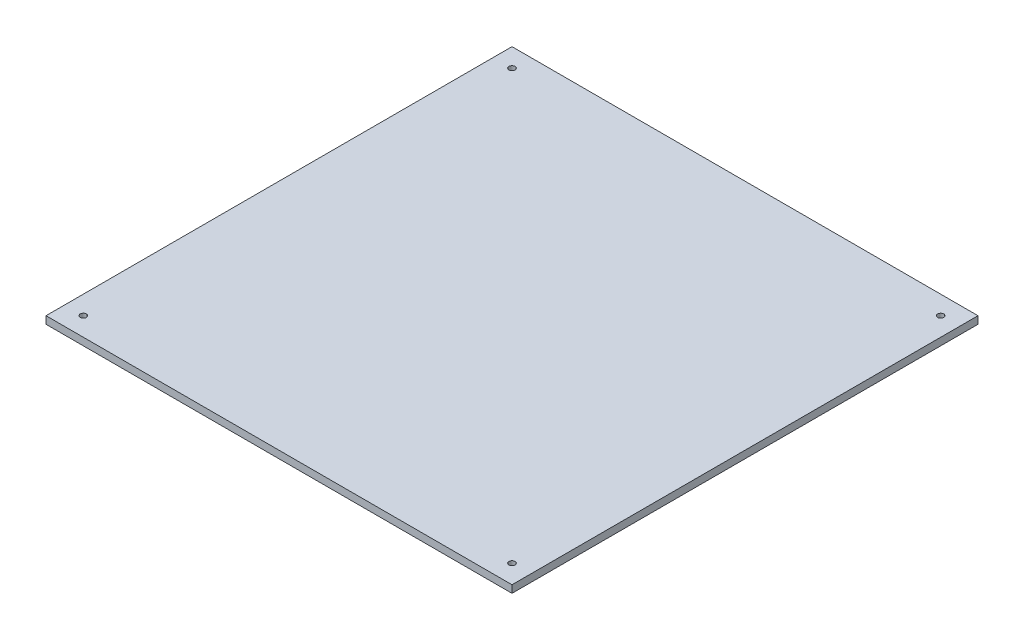
ISO-10303-21;
HEADER;
FILE_DESCRIPTION(('STEP AP214'),'2;1');
FILE_NAME('part.step','',(''),(''),'','','');
FILE_SCHEMA(('AUTOMOTIVE_DESIGN { 1 0 10303 214 1 1 1 1 }'));
ENDSEC;
DATA;
#1=APPLICATION_CONTEXT('core data for automotive mechanical design processes');
#2=APPLICATION_PROTOCOL_DEFINITION('international standard','automotive_design',2000,#1);
#3=PRODUCT_CONTEXT('',#1,'mechanical');
#4=PRODUCT('Part','Part','',(#3));
#5=PRODUCT_RELATED_PRODUCT_CATEGORY('part','',(#4));
#6=PRODUCT_DEFINITION_FORMATION('','',#4);
#7=PRODUCT_DEFINITION_CONTEXT('part definition',#1,'design');
#8=PRODUCT_DEFINITION('design','',#6,#7);
#9=PRODUCT_DEFINITION_SHAPE('','',#8);
#10=(LENGTH_UNIT() NAMED_UNIT(*) SI_UNIT(.MILLI.,.METRE.));
#11=(NAMED_UNIT(*) PLANE_ANGLE_UNIT() SI_UNIT($,.RADIAN.));
#12=(NAMED_UNIT(*) SI_UNIT($,.STERADIAN.) SOLID_ANGLE_UNIT());
#13=UNCERTAINTY_MEASURE_WITH_UNIT(LENGTH_MEASURE(1.E-05),#10,'distance_accuracy_value','');
#14=(GEOMETRIC_REPRESENTATION_CONTEXT(3) GLOBAL_UNCERTAINTY_ASSIGNED_CONTEXT((#13)) GLOBAL_UNIT_ASSIGNED_CONTEXT((#10,
#11,#12)) REPRESENTATION_CONTEXT('',''));
#15=CARTESIAN_POINT('',(0.,0.,0.));
#16=DIRECTION('',(0.,0.,1.));
#17=DIRECTION('',(1.,0.,0.));
#18=AXIS2_PLACEMENT_3D('',#15,#16,#17);
#19=CARTESIAN_POINT('',(0.,4.,0.));
#20=DIRECTION('',(0.,-1.,0.));
#21=DIRECTION('',(0.,0.,-1.));
#22=AXIS2_PLACEMENT_3D('',#19,#20,#21);
#23=PLANE('',#22);
#24=DIRECTION('',(0.,0.,1.));
#25=VECTOR('',#24,1.);
#26=CARTESIAN_POINT('',(0.,4.,0.));
#27=LINE('',#26,#25);
#28=CARTESIAN_POINT('',(0.,4.,-250.));
#29=VERTEX_POINT('',#28);
#30=CARTESIAN_POINT('',(0.,4.,0.));
#31=VERTEX_POINT('',#30);
#32=EDGE_CURVE('E96',#29,#31,#27,.T.);
#33=ORIENTED_EDGE('',*,*,#32,.T.);
#34=DIRECTION('',(1.,0.,0.));
#35=VECTOR('',#34,1.);
#36=CARTESIAN_POINT('',(0.,4.,0.));
#37=LINE('',#36,#35);
#38=CARTESIAN_POINT('',(250.,4.,0.));
#39=VERTEX_POINT('',#38);
#40=EDGE_CURVE('E91',#31,#39,#37,.T.);
#41=ORIENTED_EDGE('',*,*,#40,.T.);
#42=DIRECTION('',(0.,0.,-1.));
#43=VECTOR('',#42,1.);
#44=CARTESIAN_POINT('',(250.,4.,0.));
#45=LINE('',#44,#43);
#46=CARTESIAN_POINT('',(250.,4.,-250.));
#47=VERTEX_POINT('',#46);
#48=EDGE_CURVE('E94',#39,#47,#45,.T.);
#49=ORIENTED_EDGE('',*,*,#48,.T.);
#50=DIRECTION('',(-1.,0.,0.));
#51=VECTOR('',#50,1.);
#52=CARTESIAN_POINT('',(0.,4.,-250.));
#53=LINE('',#52,#51);
#54=EDGE_CURVE('E61',#47,#29,#53,.T.);
#55=ORIENTED_EDGE('',*,*,#54,.T.);
#56=EDGE_LOOP('',(#33,#41,#49,#55));
#57=FACE_BOUND('',#56,.T.);
#58=CARTESIAN_POINT('',(10.,4.,-10.));
#59=DIRECTION('',(0.,1.,0.));
#60=DIRECTION('',(0.,0.,1.));
#61=AXIS2_PLACEMENT_3D('',#58,#59,#60);
#62=CIRCLE('',#61,1.65);
#63=CARTESIAN_POINT('',(10.,4.,-8.35));
#64=VERTEX_POINT('',#63);
#65=EDGE_CURVE('E111',#64,#64,#62,.T.);
#66=ORIENTED_EDGE('',*,*,#65,.F.);
#67=EDGE_LOOP('',(#66));
#68=FACE_BOUND('',#67,.T.);
#69=CARTESIAN_POINT('',(240.,4.,-10.));
#70=DIRECTION('',(0.,1.,0.));
#71=DIRECTION('',(0.,0.,-1.));
#72=AXIS2_PLACEMENT_3D('',#69,#70,#71);
#73=CIRCLE('',#72,1.65000000000002);
#74=CARTESIAN_POINT('',(240.,4.,-11.65));
#75=VERTEX_POINT('',#74);
#76=EDGE_CURVE('E126',#75,#75,#73,.T.);
#77=ORIENTED_EDGE('',*,*,#76,.F.);
#78=EDGE_LOOP('',(#77));
#79=FACE_BOUND('',#78,.T.);
#80=CARTESIAN_POINT('',(240.,4.,-240.));
#81=DIRECTION('',(0.,1.,0.));
#82=DIRECTION('',(0.,0.,1.));
#83=AXIS2_PLACEMENT_3D('',#80,#81,#82);
#84=CIRCLE('',#83,1.65000000000002);
#85=CARTESIAN_POINT('',(240.,4.,-238.35));
#86=VERTEX_POINT('',#85);
#87=EDGE_CURVE('E132',#86,#86,#84,.T.);
#88=ORIENTED_EDGE('',*,*,#87,.F.);
#89=EDGE_LOOP('',(#88));
#90=FACE_BOUND('',#89,.T.);
#91=CARTESIAN_POINT('',(10.,4.,-240.));
#92=DIRECTION('',(0.,1.,0.));
#93=DIRECTION('',(0.,0.,-1.));
#94=AXIS2_PLACEMENT_3D('',#91,#92,#93);
#95=CIRCLE('',#94,1.65);
#96=CARTESIAN_POINT('',(10.,4.,-241.65));
#97=VERTEX_POINT('',#96);
#98=EDGE_CURVE('E138',#97,#97,#95,.T.);
#99=ORIENTED_EDGE('',*,*,#98,.F.);
#100=EDGE_LOOP('',(#99));
#101=FACE_BOUND('',#100,.T.);
#102=ADVANCED_FACE('F44',(#57,#68,#79,#90,#101),#23,.F.);
#103=CARTESIAN_POINT('',(0.,0.,0.));
#104=DIRECTION('',(0.,-1.,0.));
#105=DIRECTION('',(0.,0.,-1.));
#106=AXIS2_PLACEMENT_3D('',#103,#104,#105);
#107=PLANE('',#106);
#108=CARTESIAN_POINT('',(240.,0.,-240.));
#109=DIRECTION('',(0.,1.,0.));
#110=DIRECTION('',(0.,0.,1.));
#111=AXIS2_PLACEMENT_3D('',#108,#109,#110);
#112=CIRCLE('',#111,1.65000000000002);
#113=CARTESIAN_POINT('',(240.,0.,-238.35));
#114=VERTEX_POINT('',#113);
#115=EDGE_CURVE('E135',#114,#114,#112,.T.);
#116=ORIENTED_EDGE('',*,*,#115,.T.);
#117=EDGE_LOOP('',(#116));
#118=FACE_BOUND('',#117,.T.);
#119=CARTESIAN_POINT('',(10.,0.,-10.));
#120=DIRECTION('',(0.,1.,0.));
#121=DIRECTION('',(0.,0.,1.));
#122=AXIS2_PLACEMENT_3D('',#119,#120,#121);
#123=CIRCLE('',#122,1.65);
#124=CARTESIAN_POINT('',(10.,0.,-8.35));
#125=VERTEX_POINT('',#124);
#126=EDGE_CURVE('E123',#125,#125,#123,.T.);
#127=ORIENTED_EDGE('',*,*,#126,.T.);
#128=EDGE_LOOP('',(#127));
#129=FACE_BOUND('',#128,.T.);
#130=DIRECTION('',(0.,0.,1.));
#131=VECTOR('',#130,1.);
#132=CARTESIAN_POINT('',(0.,0.,0.));
#133=LINE('',#132,#131);
#134=CARTESIAN_POINT('',(0.,0.,-250.));
#135=VERTEX_POINT('',#134);
#136=CARTESIAN_POINT('',(0.,0.,0.));
#137=VERTEX_POINT('',#136);
#138=EDGE_CURVE('E108',#135,#137,#133,.T.);
#139=ORIENTED_EDGE('',*,*,#138,.F.);
#140=DIRECTION('',(-1.,0.,0.));
#141=VECTOR('',#140,1.);
#142=CARTESIAN_POINT('',(0.,0.,-250.));
#143=LINE('',#142,#141);
#144=CARTESIAN_POINT('',(250.,0.,-250.));
#145=VERTEX_POINT('',#144);
#146=EDGE_CURVE('E84',#145,#135,#143,.T.);
#147=ORIENTED_EDGE('',*,*,#146,.F.);
#148=DIRECTION('',(0.,0.,-1.));
#149=VECTOR('',#148,1.);
#150=CARTESIAN_POINT('',(250.,0.,0.));
#151=LINE('',#150,#149);
#152=CARTESIAN_POINT('',(250.,0.,0.));
#153=VERTEX_POINT('',#152);
#154=EDGE_CURVE('E78',#153,#145,#151,.T.);
#155=ORIENTED_EDGE('',*,*,#154,.F.);
#156=DIRECTION('',(1.,0.,0.));
#157=VECTOR('',#156,1.);
#158=CARTESIAN_POINT('',(0.,0.,0.));
#159=LINE('',#158,#157);
#160=EDGE_CURVE('E100',#137,#153,#159,.T.);
#161=ORIENTED_EDGE('',*,*,#160,.F.);
#162=EDGE_LOOP('',(#139,#147,#155,#161));
#163=FACE_BOUND('',#162,.T.);
#164=CARTESIAN_POINT('',(240.,0.,-10.));
#165=DIRECTION('',(0.,1.,0.));
#166=DIRECTION('',(0.,0.,-1.));
#167=AXIS2_PLACEMENT_3D('',#164,#165,#166);
#168=CIRCLE('',#167,1.65000000000002);
#169=CARTESIAN_POINT('',(240.,0.,-11.65));
#170=VERTEX_POINT('',#169);
#171=EDGE_CURVE('E129',#170,#170,#168,.T.);
#172=ORIENTED_EDGE('',*,*,#171,.T.);
#173=EDGE_LOOP('',(#172));
#174=FACE_BOUND('',#173,.T.);
#175=CARTESIAN_POINT('',(10.,0.,-240.));
#176=DIRECTION('',(0.,1.,0.));
#177=DIRECTION('',(0.,0.,-1.));
#178=AXIS2_PLACEMENT_3D('',#175,#176,#177);
#179=CIRCLE('',#178,1.65);
#180=CARTESIAN_POINT('',(10.,0.,-241.65));
#181=VERTEX_POINT('',#180);
#182=EDGE_CURVE('E141',#181,#181,#179,.T.);
#183=ORIENTED_EDGE('',*,*,#182,.T.);
#184=EDGE_LOOP('',(#183));
#185=FACE_BOUND('',#184,.T.);
#186=ADVANCED_FACE('F119',(#118,#129,#163,#174,#185),#107,.T.);
#187=CARTESIAN_POINT('',(0.,4.,0.));
#188=DIRECTION('',(1.,0.,0.));
#189=DIRECTION('',(0.,0.,-1.));
#190=AXIS2_PLACEMENT_3D('',#187,#188,#189);
#191=PLANE('',#190);
#192=ORIENTED_EDGE('',*,*,#138,.T.);
#193=DIRECTION('',(0.,-1.,0.));
#194=VECTOR('',#193,1.);
#195=CARTESIAN_POINT('',(0.,4.,0.));
#196=LINE('',#195,#194);
#197=EDGE_CURVE('E11',#31,#137,#196,.T.);
#198=ORIENTED_EDGE('',*,*,#197,.F.);
#199=ORIENTED_EDGE('',*,*,#32,.F.);
#200=DIRECTION('',(0.,-1.,0.));
#201=VECTOR('',#200,1.);
#202=CARTESIAN_POINT('',(0.,4.,-250.));
#203=LINE('',#202,#201);
#204=EDGE_CURVE('E104',#29,#135,#203,.T.);
#205=ORIENTED_EDGE('',*,*,#204,.T.);
#206=EDGE_LOOP('',(#192,#198,#199,#205));
#207=FACE_BOUND('',#206,.T.);
#208=ADVANCED_FACE('F46',(#207),#191,.F.);
#209=CARTESIAN_POINT('',(0.,4.,0.));
#210=DIRECTION('',(0.,0.,-1.));
#211=DIRECTION('',(-1.,0.,0.));
#212=AXIS2_PLACEMENT_3D('',#209,#210,#211);
#213=PLANE('',#212);
#214=ORIENTED_EDGE('',*,*,#160,.T.);
#215=DIRECTION('',(0.,-1.,0.));
#216=VECTOR('',#215,1.);
#217=CARTESIAN_POINT('',(250.,4.,0.));
#218=LINE('',#217,#216);
#219=EDGE_CURVE('E53',#39,#153,#218,.T.);
#220=ORIENTED_EDGE('',*,*,#219,.F.);
#221=ORIENTED_EDGE('',*,*,#40,.F.);
#222=ORIENTED_EDGE('',*,*,#197,.T.);
#223=EDGE_LOOP('',(#214,#220,#221,#222));
#224=FACE_BOUND('',#223,.T.);
#225=ADVANCED_FACE('F99',(#224),#213,.F.);
#226=CARTESIAN_POINT('',(250.,4.,0.));
#227=DIRECTION('',(-1.,0.,0.));
#228=DIRECTION('',(0.,0.,1.));
#229=AXIS2_PLACEMENT_3D('',#226,#227,#228);
#230=PLANE('',#229);
#231=ORIENTED_EDGE('',*,*,#154,.T.);
#232=DIRECTION('',(0.,-1.,0.));
#233=VECTOR('',#232,1.);
#234=CARTESIAN_POINT('',(250.,4.,-250.));
#235=LINE('',#234,#233);
#236=EDGE_CURVE('E101',#47,#145,#235,.T.);
#237=ORIENTED_EDGE('',*,*,#236,.F.);
#238=ORIENTED_EDGE('',*,*,#48,.F.);
#239=ORIENTED_EDGE('',*,*,#219,.T.);
#240=EDGE_LOOP('',(#231,#237,#238,#239));
#241=FACE_BOUND('',#240,.T.);
#242=ADVANCED_FACE('F102',(#241),#230,.F.);
#243=CARTESIAN_POINT('',(0.,4.,-250.));
#244=DIRECTION('',(0.,0.,1.));
#245=DIRECTION('',(1.,0.,0.));
#246=AXIS2_PLACEMENT_3D('',#243,#244,#245);
#247=PLANE('',#246);
#248=ORIENTED_EDGE('',*,*,#146,.T.);
#249=ORIENTED_EDGE('',*,*,#204,.F.);
#250=ORIENTED_EDGE('',*,*,#54,.F.);
#251=ORIENTED_EDGE('',*,*,#236,.T.);
#252=EDGE_LOOP('',(#248,#249,#250,#251));
#253=FACE_BOUND('',#252,.T.);
#254=ADVANCED_FACE('F116',(#253),#247,.F.);
#255=CARTESIAN_POINT('',(10.,4.,-10.));
#256=DIRECTION('',(0.,-1.,0.));
#257=DIRECTION('',(0.,0.,-1.));
#258=AXIS2_PLACEMENT_3D('',#255,#256,#257);
#259=CYLINDRICAL_SURFACE('',#258,1.65);
#260=ORIENTED_EDGE('',*,*,#65,.T.);
#261=EDGE_LOOP('',(#260));
#262=FACE_BOUND('',#261,.T.);
#263=ORIENTED_EDGE('',*,*,#126,.F.);
#264=EDGE_LOOP('',(#263));
#265=FACE_BOUND('',#264,.T.);
#266=ADVANCED_FACE('F158',(#262,#265),#259,.F.);
#267=CARTESIAN_POINT('',(240.,4.,-10.));
#268=DIRECTION('',(0.,-1.,0.));
#269=DIRECTION('',(0.,0.,-1.));
#270=AXIS2_PLACEMENT_3D('',#267,#268,#269);
#271=CYLINDRICAL_SURFACE('',#270,1.65000000000002);
#272=ORIENTED_EDGE('',*,*,#76,.T.);
#273=EDGE_LOOP('',(#272));
#274=FACE_BOUND('',#273,.T.);
#275=ORIENTED_EDGE('',*,*,#171,.F.);
#276=EDGE_LOOP('',(#275));
#277=FACE_BOUND('',#276,.T.);
#278=ADVANCED_FACE('F226',(#274,#277),#271,.F.);
#279=CARTESIAN_POINT('',(240.,4.,-240.));
#280=DIRECTION('',(0.,-1.,0.));
#281=DIRECTION('',(0.,0.,-1.));
#282=AXIS2_PLACEMENT_3D('',#279,#280,#281);
#283=CYLINDRICAL_SURFACE('',#282,1.65000000000002);
#284=ORIENTED_EDGE('',*,*,#87,.T.);
#285=EDGE_LOOP('',(#284));
#286=FACE_BOUND('',#285,.T.);
#287=ORIENTED_EDGE('',*,*,#115,.F.);
#288=EDGE_LOOP('',(#287));
#289=FACE_BOUND('',#288,.T.);
#290=ADVANCED_FACE('F237',(#286,#289),#283,.F.);
#291=CARTESIAN_POINT('',(10.,4.,-240.));
#292=DIRECTION('',(0.,-1.,0.));
#293=DIRECTION('',(0.,0.,-1.));
#294=AXIS2_PLACEMENT_3D('',#291,#292,#293);
#295=CYLINDRICAL_SURFACE('',#294,1.65);
#296=ORIENTED_EDGE('',*,*,#98,.T.);
#297=EDGE_LOOP('',(#296));
#298=FACE_BOUND('',#297,.T.);
#299=ORIENTED_EDGE('',*,*,#182,.F.);
#300=EDGE_LOOP('',(#299));
#301=FACE_BOUND('',#300,.T.);
#302=ADVANCED_FACE('F147',(#298,#301),#295,.F.);
#303=CLOSED_SHELL('',(#102,#186,#208,#225,#242,#254,#266,#278,#290,#302));
#304=MANIFOLD_SOLID_BREP('B2',#303);
#305=ADVANCED_BREP_SHAPE_REPRESENTATION('',(#18,#304),#14);
#306=SHAPE_DEFINITION_REPRESENTATION(#9,#305);
ENDSEC;
END-ISO-10303-21;
